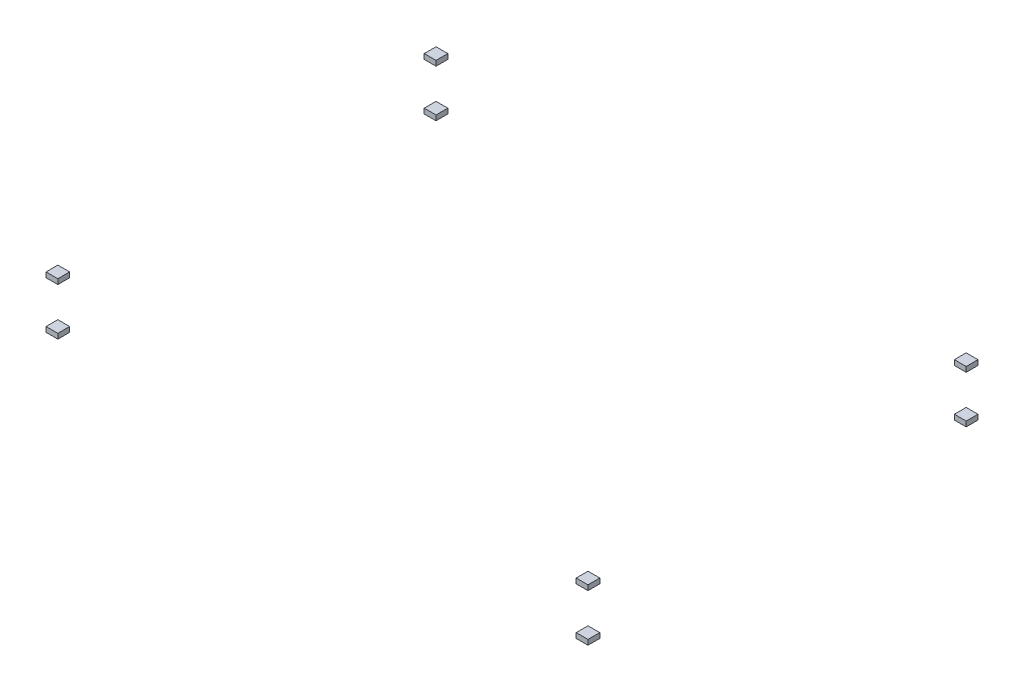
ISO-10303-21;
HEADER;
FILE_DESCRIPTION(('STEP AP214'),'2;1');
FILE_NAME('part.step','',(''),(''),'','','');
FILE_SCHEMA(('AUTOMOTIVE_DESIGN { 1 0 10303 214 1 1 1 1 }'));
ENDSEC;
DATA;
#1=APPLICATION_CONTEXT('core data for automotive mechanical design processes');
#2=APPLICATION_PROTOCOL_DEFINITION('international standard','automotive_design',2000,#1);
#3=PRODUCT_CONTEXT('',#1,'mechanical');
#4=PRODUCT('Part','Part','',(#3));
#5=PRODUCT_RELATED_PRODUCT_CATEGORY('part','',(#4));
#6=PRODUCT_DEFINITION_FORMATION('','',#4);
#7=PRODUCT_DEFINITION_CONTEXT('part definition',#1,'design');
#8=PRODUCT_DEFINITION('design','',#6,#7);
#9=PRODUCT_DEFINITION_SHAPE('','',#8);
#10=(LENGTH_UNIT() NAMED_UNIT(*) SI_UNIT(.MILLI.,.METRE.));
#11=(NAMED_UNIT(*) PLANE_ANGLE_UNIT() SI_UNIT($,.RADIAN.));
#12=(NAMED_UNIT(*) SI_UNIT($,.STERADIAN.) SOLID_ANGLE_UNIT());
#13=UNCERTAINTY_MEASURE_WITH_UNIT(LENGTH_MEASURE(1.E-05),#10,'distance_accuracy_value','');
#14=(GEOMETRIC_REPRESENTATION_CONTEXT(3) GLOBAL_UNCERTAINTY_ASSIGNED_CONTEXT((#13)) GLOBAL_UNIT_ASSIGNED_CONTEXT((#10,
#11,#12)) REPRESENTATION_CONTEXT('',''));
#15=CARTESIAN_POINT('',(0.,0.,0.));
#16=DIRECTION('',(0.,0.,1.));
#17=DIRECTION('',(1.,0.,0.));
#18=AXIS2_PLACEMENT_3D('',#15,#16,#17);
#19=CARTESIAN_POINT('',(3070.,250.,2310.));
#20=DIRECTION('',(1.,0.,0.));
#21=DIRECTION('',(0.,0.,-1.));
#22=AXIS2_PLACEMENT_3D('',#19,#20,#21);
#23=PLANE('',#22);
#24=DIRECTION('',(0.,-1.,0.));
#25=VECTOR('',#24,1.);
#26=CARTESIAN_POINT('',(3070.,250.,2170.));
#27=LINE('',#26,#25);
#28=CARTESIAN_POINT('',(3070.,310.,2170.));
#29=VERTEX_POINT('',#28);
#30=CARTESIAN_POINT('',(3070.,250.,2170.));
#31=VERTEX_POINT('',#30);
#32=EDGE_CURVE('E114',#29,#31,#27,.T.);
#33=ORIENTED_EDGE('',*,*,#32,.T.);
#34=DIRECTION('',(0.,0.,-1.));
#35=VECTOR('',#34,1.);
#36=CARTESIAN_POINT('',(3070.,250.,2310.));
#37=LINE('',#36,#35);
#38=CARTESIAN_POINT('',(3070.,250.,2310.));
#39=VERTEX_POINT('',#38);
#40=EDGE_CURVE('E12',#39,#31,#37,.T.);
#41=ORIENTED_EDGE('',*,*,#40,.F.);
#42=DIRECTION('',(0.,-1.,0.));
#43=VECTOR('',#42,1.);
#44=CARTESIAN_POINT('',(3070.,250.,2310.));
#45=LINE('',#44,#43);
#46=CARTESIAN_POINT('',(3070.,310.,2310.));
#47=VERTEX_POINT('',#46);
#48=EDGE_CURVE('E101',#47,#39,#45,.T.);
#49=ORIENTED_EDGE('',*,*,#48,.F.);
#50=DIRECTION('',(0.,0.,-1.));
#51=VECTOR('',#50,1.);
#52=CARTESIAN_POINT('',(3070.,310.,2310.));
#53=LINE('',#52,#51);
#54=EDGE_CURVE('E108',#47,#29,#53,.T.);
#55=ORIENTED_EDGE('',*,*,#54,.T.);
#56=EDGE_LOOP('',(#33,#41,#49,#55));
#57=FACE_BOUND('',#56,.T.);
#58=ADVANCED_FACE('F49',(#57),#23,.F.);
#59=CARTESIAN_POINT('',(3070.,250.,2310.));
#60=DIRECTION('',(0.,1.,0.));
#61=DIRECTION('',(0.,0.,1.));
#62=AXIS2_PLACEMENT_3D('',#59,#60,#61);
#63=PLANE('',#62);
#64=DIRECTION('',(1.,0.,0.));
#65=VECTOR('',#64,1.);
#66=CARTESIAN_POINT('',(3070.,250.,2170.));
#67=LINE('',#66,#65);
#68=CARTESIAN_POINT('',(3210.,250.,2170.));
#69=VERTEX_POINT('',#68);
#70=EDGE_CURVE('E104',#31,#69,#67,.T.);
#71=ORIENTED_EDGE('',*,*,#70,.T.);
#72=DIRECTION('',(0.,0.,-1.));
#73=VECTOR('',#72,1.);
#74=CARTESIAN_POINT('',(3210.,250.,2310.));
#75=LINE('',#74,#73);
#76=CARTESIAN_POINT('',(3210.,250.,2310.));
#77=VERTEX_POINT('',#76);
#78=EDGE_CURVE('E59',#77,#69,#75,.T.);
#79=ORIENTED_EDGE('',*,*,#78,.F.);
#80=DIRECTION('',(1.,0.,0.));
#81=VECTOR('',#80,1.);
#82=CARTESIAN_POINT('',(3070.,250.,2310.));
#83=LINE('',#82,#81);
#84=EDGE_CURVE('E96',#39,#77,#83,.T.);
#85=ORIENTED_EDGE('',*,*,#84,.F.);
#86=ORIENTED_EDGE('',*,*,#40,.T.);
#87=EDGE_LOOP('',(#71,#79,#85,#86));
#88=FACE_BOUND('',#87,.T.);
#89=ADVANCED_FACE('F102',(#88),#63,.F.);
#90=CARTESIAN_POINT('',(3210.,250.,2310.));
#91=DIRECTION('',(-1.,0.,0.));
#92=DIRECTION('',(0.,0.,1.));
#93=AXIS2_PLACEMENT_3D('',#90,#91,#92);
#94=PLANE('',#93);
#95=DIRECTION('',(0.,1.,0.));
#96=VECTOR('',#95,1.);
#97=CARTESIAN_POINT('',(3210.,250.,2170.));
#98=LINE('',#97,#96);
#99=CARTESIAN_POINT('',(3210.,310.,2170.));
#100=VERTEX_POINT('',#99);
#101=EDGE_CURVE('E84',#69,#100,#98,.T.);
#102=ORIENTED_EDGE('',*,*,#101,.T.);
#103=DIRECTION('',(0.,0.,-1.));
#104=VECTOR('',#103,1.);
#105=CARTESIAN_POINT('',(3210.,310.,2310.));
#106=LINE('',#105,#104);
#107=CARTESIAN_POINT('',(3210.,310.,2310.));
#108=VERTEX_POINT('',#107);
#109=EDGE_CURVE('E106',#108,#100,#106,.T.);
#110=ORIENTED_EDGE('',*,*,#109,.F.);
#111=DIRECTION('',(0.,1.,0.));
#112=VECTOR('',#111,1.);
#113=CARTESIAN_POINT('',(3210.,250.,2310.));
#114=LINE('',#113,#112);
#115=EDGE_CURVE('E97',#77,#108,#114,.T.);
#116=ORIENTED_EDGE('',*,*,#115,.F.);
#117=ORIENTED_EDGE('',*,*,#78,.T.);
#118=EDGE_LOOP('',(#102,#110,#116,#117));
#119=FACE_BOUND('',#118,.T.);
#120=ADVANCED_FACE('F110',(#119),#94,.F.);
#121=CARTESIAN_POINT('',(3070.,310.,2310.));
#122=DIRECTION('',(0.,-1.,0.));
#123=DIRECTION('',(0.,0.,-1.));
#124=AXIS2_PLACEMENT_3D('',#121,#122,#123);
#125=PLANE('',#124);
#126=DIRECTION('',(-1.,0.,0.));
#127=VECTOR('',#126,1.);
#128=CARTESIAN_POINT('',(3070.,310.,2170.));
#129=LINE('',#128,#127);
#130=EDGE_CURVE('E90',#100,#29,#129,.T.);
#131=ORIENTED_EDGE('',*,*,#130,.T.);
#132=ORIENTED_EDGE('',*,*,#54,.F.);
#133=DIRECTION('',(-1.,0.,0.));
#134=VECTOR('',#133,1.);
#135=CARTESIAN_POINT('',(3070.,310.,2310.));
#136=LINE('',#135,#134);
#137=EDGE_CURVE('E67',#108,#47,#136,.T.);
#138=ORIENTED_EDGE('',*,*,#137,.F.);
#139=ORIENTED_EDGE('',*,*,#109,.T.);
#140=EDGE_LOOP('',(#131,#132,#138,#139));
#141=FACE_BOUND('',#140,.T.);
#142=ADVANCED_FACE('F118',(#141),#125,.F.);
#143=CARTESIAN_POINT('',(0.,0.,2310.));
#144=DIRECTION('',(0.,0.,-1.));
#145=DIRECTION('',(-1.,0.,0.));
#146=AXIS2_PLACEMENT_3D('',#143,#144,#145);
#147=PLANE('',#146);
#148=ORIENTED_EDGE('',*,*,#48,.T.);
#149=ORIENTED_EDGE('',*,*,#84,.T.);
#150=ORIENTED_EDGE('',*,*,#115,.T.);
#151=ORIENTED_EDGE('',*,*,#137,.T.);
#152=EDGE_LOOP('',(#148,#149,#150,#151));
#153=FACE_BOUND('',#152,.T.);
#154=ADVANCED_FACE('F100',(#153),#147,.F.);
#155=CARTESIAN_POINT('',(0.,0.,2170.));
#156=DIRECTION('',(0.,0.,-1.));
#157=DIRECTION('',(-1.,0.,0.));
#158=AXIS2_PLACEMENT_3D('',#155,#156,#157);
#159=PLANE('',#158);
#160=ORIENTED_EDGE('',*,*,#32,.F.);
#161=ORIENTED_EDGE('',*,*,#130,.F.);
#162=ORIENTED_EDGE('',*,*,#101,.F.);
#163=ORIENTED_EDGE('',*,*,#70,.F.);
#164=EDGE_LOOP('',(#160,#161,#162,#163));
#165=FACE_BOUND('',#164,.T.);
#166=ADVANCED_FACE('F124',(#165),#159,.T.);
#167=CLOSED_SHELL('',(#58,#89,#120,#142,#154,#166));
#168=MANIFOLD_SOLID_BREP('B2',#167);
#169=CARTESIAN_POINT('',(3070.,250.,-2170.));
#170=DIRECTION('',(1.,0.,0.));
#171=DIRECTION('',(0.,0.,-1.));
#172=AXIS2_PLACEMENT_3D('',#169,#170,#171);
#173=PLANE('',#172);
#174=DIRECTION('',(0.,-1.,0.));
#175=VECTOR('',#174,1.);
#176=CARTESIAN_POINT('',(3070.,250.,-2310.));
#177=LINE('',#176,#175);
#178=CARTESIAN_POINT('',(3070.,310.,-2310.));
#179=VERTEX_POINT('',#178);
#180=CARTESIAN_POINT('',(3070.,250.,-2310.));
#181=VERTEX_POINT('',#180);
#182=EDGE_CURVE('E250',#179,#181,#177,.T.);
#183=ORIENTED_EDGE('',*,*,#182,.T.);
#184=DIRECTION('',(0.,0.,-1.));
#185=VECTOR('',#184,1.);
#186=CARTESIAN_POINT('',(3070.,250.,-2170.));
#187=LINE('',#186,#185);
#188=CARTESIAN_POINT('',(3070.,250.,-2170.));
#189=VERTEX_POINT('',#188);
#190=EDGE_CURVE('E48',#189,#181,#187,.T.);
#191=ORIENTED_EDGE('',*,*,#190,.F.);
#192=DIRECTION('',(0.,-1.,0.));
#193=VECTOR('',#192,1.);
#194=CARTESIAN_POINT('',(3070.,250.,-2170.));
#195=LINE('',#194,#193);
#196=CARTESIAN_POINT('',(3070.,310.,-2170.));
#197=VERTEX_POINT('',#196);
#198=EDGE_CURVE('E233',#197,#189,#195,.T.);
#199=ORIENTED_EDGE('',*,*,#198,.F.);
#200=DIRECTION('',(0.,0.,-1.));
#201=VECTOR('',#200,1.);
#202=CARTESIAN_POINT('',(3070.,310.,-2170.));
#203=LINE('',#202,#201);
#204=EDGE_CURVE('E245',#197,#179,#203,.T.);
#205=ORIENTED_EDGE('',*,*,#204,.T.);
#206=EDGE_LOOP('',(#183,#191,#199,#205));
#207=FACE_BOUND('',#206,.T.);
#208=ADVANCED_FACE('F184',(#207),#173,.F.);
#209=CARTESIAN_POINT('',(3070.,250.,-2170.));
#210=DIRECTION('',(0.,1.,0.));
#211=DIRECTION('',(0.,0.,1.));
#212=AXIS2_PLACEMENT_3D('',#209,#210,#211);
#213=PLANE('',#212);
#214=DIRECTION('',(1.,0.,0.));
#215=VECTOR('',#214,1.);
#216=CARTESIAN_POINT('',(3070.,250.,-2310.));
#217=LINE('',#216,#215);
#218=CARTESIAN_POINT('',(3210.,250.,-2310.));
#219=VERTEX_POINT('',#218);
#220=EDGE_CURVE('E239',#181,#219,#217,.T.);
#221=ORIENTED_EDGE('',*,*,#220,.T.);
#222=DIRECTION('',(0.,0.,-1.));
#223=VECTOR('',#222,1.);
#224=CARTESIAN_POINT('',(3210.,250.,-2170.));
#225=LINE('',#224,#223);
#226=CARTESIAN_POINT('',(3210.,250.,-2170.));
#227=VERTEX_POINT('',#226);
#228=EDGE_CURVE('E195',#227,#219,#225,.T.);
#229=ORIENTED_EDGE('',*,*,#228,.F.);
#230=DIRECTION('',(1.,0.,0.));
#231=VECTOR('',#230,1.);
#232=CARTESIAN_POINT('',(3070.,250.,-2170.));
#233=LINE('',#232,#231);
#234=EDGE_CURVE('E228',#189,#227,#233,.T.);
#235=ORIENTED_EDGE('',*,*,#234,.F.);
#236=ORIENTED_EDGE('',*,*,#190,.T.);
#237=EDGE_LOOP('',(#221,#229,#235,#236));
#238=FACE_BOUND('',#237,.T.);
#239=ADVANCED_FACE('F236',(#238),#213,.F.);
#240=CARTESIAN_POINT('',(3210.,250.,-2170.));
#241=DIRECTION('',(-1.,0.,0.));
#242=DIRECTION('',(0.,0.,1.));
#243=AXIS2_PLACEMENT_3D('',#240,#241,#242);
#244=PLANE('',#243);
#245=DIRECTION('',(0.,1.,0.));
#246=VECTOR('',#245,1.);
#247=CARTESIAN_POINT('',(3210.,250.,-2310.));
#248=LINE('',#247,#246);
#249=CARTESIAN_POINT('',(3210.,310.,-2310.));
#250=VERTEX_POINT('',#249);
#251=EDGE_CURVE('E220',#219,#250,#248,.T.);
#252=ORIENTED_EDGE('',*,*,#251,.T.);
#253=DIRECTION('',(0.,0.,-1.));
#254=VECTOR('',#253,1.);
#255=CARTESIAN_POINT('',(3210.,310.,-2170.));
#256=LINE('',#255,#254);
#257=CARTESIAN_POINT('',(3210.,310.,-2170.));
#258=VERTEX_POINT('',#257);
#259=EDGE_CURVE('E238',#258,#250,#256,.T.);
#260=ORIENTED_EDGE('',*,*,#259,.F.);
#261=DIRECTION('',(0.,1.,0.));
#262=VECTOR('',#261,1.);
#263=CARTESIAN_POINT('',(3210.,250.,-2170.));
#264=LINE('',#263,#262);
#265=EDGE_CURVE('E234',#227,#258,#264,.T.);
#266=ORIENTED_EDGE('',*,*,#265,.F.);
#267=ORIENTED_EDGE('',*,*,#228,.T.);
#268=EDGE_LOOP('',(#252,#260,#266,#267));
#269=FACE_BOUND('',#268,.T.);
#270=ADVANCED_FACE('F242',(#269),#244,.F.);
#271=CARTESIAN_POINT('',(3070.,310.,-2170.));
#272=DIRECTION('',(0.,-1.,0.));
#273=DIRECTION('',(0.,0.,-1.));
#274=AXIS2_PLACEMENT_3D('',#271,#272,#273);
#275=PLANE('',#274);
#276=DIRECTION('',(-1.,0.,0.));
#277=VECTOR('',#276,1.);
#278=CARTESIAN_POINT('',(3070.,310.,-2310.));
#279=LINE('',#278,#277);
#280=EDGE_CURVE('E224',#250,#179,#279,.T.);
#281=ORIENTED_EDGE('',*,*,#280,.T.);
#282=ORIENTED_EDGE('',*,*,#204,.F.);
#283=DIRECTION('',(-1.,0.,0.));
#284=VECTOR('',#283,1.);
#285=CARTESIAN_POINT('',(3070.,310.,-2170.));
#286=LINE('',#285,#284);
#287=EDGE_CURVE('E199',#258,#197,#286,.T.);
#288=ORIENTED_EDGE('',*,*,#287,.F.);
#289=ORIENTED_EDGE('',*,*,#259,.T.);
#290=EDGE_LOOP('',(#281,#282,#288,#289));
#291=FACE_BOUND('',#290,.T.);
#292=ADVANCED_FACE('F255',(#291),#275,.F.);
#293=CARTESIAN_POINT('',(0.,0.,-2170.));
#294=DIRECTION('',(0.,0.,-1.));
#295=DIRECTION('',(-1.,0.,0.));
#296=AXIS2_PLACEMENT_3D('',#293,#294,#295);
#297=PLANE('',#296);
#298=ORIENTED_EDGE('',*,*,#198,.T.);
#299=ORIENTED_EDGE('',*,*,#234,.T.);
#300=ORIENTED_EDGE('',*,*,#265,.T.);
#301=ORIENTED_EDGE('',*,*,#287,.T.);
#302=EDGE_LOOP('',(#298,#299,#300,#301));
#303=FACE_BOUND('',#302,.T.);
#304=ADVANCED_FACE('F232',(#303),#297,.F.);
#305=CARTESIAN_POINT('',(0.,0.,-2310.));
#306=DIRECTION('',(0.,0.,-1.));
#307=DIRECTION('',(-1.,0.,0.));
#308=AXIS2_PLACEMENT_3D('',#305,#306,#307);
#309=PLANE('',#308);
#310=ORIENTED_EDGE('',*,*,#182,.F.);
#311=ORIENTED_EDGE('',*,*,#280,.F.);
#312=ORIENTED_EDGE('',*,*,#251,.F.);
#313=ORIENTED_EDGE('',*,*,#220,.F.);
#314=EDGE_LOOP('',(#310,#311,#312,#313));
#315=FACE_BOUND('',#314,.T.);
#316=ADVANCED_FACE('F260',(#315),#309,.T.);
#317=CLOSED_SHELL('',(#208,#239,#270,#292,#304,#316));
#318=MANIFOLD_SOLID_BREP('B6',#317);
#319=CARTESIAN_POINT('',(3070.,-310.,2310.));
#320=DIRECTION('',(1.,0.,0.));
#321=DIRECTION('',(0.,0.,-1.));
#322=AXIS2_PLACEMENT_3D('',#319,#320,#321);
#323=PLANE('',#322);
#324=DIRECTION('',(0.,-1.,0.));
#325=VECTOR('',#324,1.);
#326=CARTESIAN_POINT('',(3070.,-310.,2170.));
#327=LINE('',#326,#325);
#328=CARTESIAN_POINT('',(3070.,-250.,2170.));
#329=VERTEX_POINT('',#328);
#330=CARTESIAN_POINT('',(3070.,-310.,2170.));
#331=VERTEX_POINT('',#330);
#332=EDGE_CURVE('E381',#329,#331,#327,.T.);
#333=ORIENTED_EDGE('',*,*,#332,.T.);
#334=DIRECTION('',(0.,0.,-1.));
#335=VECTOR('',#334,1.);
#336=CARTESIAN_POINT('',(3070.,-310.,2310.));
#337=LINE('',#336,#335);
#338=CARTESIAN_POINT('',(3070.,-310.,2310.));
#339=VERTEX_POINT('',#338);
#340=EDGE_CURVE('E185',#339,#331,#337,.T.);
#341=ORIENTED_EDGE('',*,*,#340,.F.);
#342=DIRECTION('',(0.,-1.,0.));
#343=VECTOR('',#342,1.);
#344=CARTESIAN_POINT('',(3070.,-310.,2310.));
#345=LINE('',#344,#343);
#346=CARTESIAN_POINT('',(3070.,-250.,2310.));
#347=VERTEX_POINT('',#346);
#348=EDGE_CURVE('E369',#347,#339,#345,.T.);
#349=ORIENTED_EDGE('',*,*,#348,.F.);
#350=DIRECTION('',(0.,0.,-1.));
#351=VECTOR('',#350,1.);
#352=CARTESIAN_POINT('',(3070.,-250.,2310.));
#353=LINE('',#352,#351);
#354=EDGE_CURVE('E380',#347,#329,#353,.T.);
#355=ORIENTED_EDGE('',*,*,#354,.T.);
#356=EDGE_LOOP('',(#333,#341,#349,#355));
#357=FACE_BOUND('',#356,.T.);
#358=ADVANCED_FACE('F318',(#357),#323,.F.);
#359=CARTESIAN_POINT('',(3070.,-310.,2310.));
#360=DIRECTION('',(0.,1.,0.));
#361=DIRECTION('',(0.,0.,1.));
#362=AXIS2_PLACEMENT_3D('',#359,#360,#361);
#363=PLANE('',#362);
#364=DIRECTION('',(1.,0.,0.));
#365=VECTOR('',#364,1.);
#366=CARTESIAN_POINT('',(3070.,-310.,2170.));
#367=LINE('',#366,#365);
#368=CARTESIAN_POINT('',(3210.,-310.,2170.));
#369=VERTEX_POINT('',#368);
#370=EDGE_CURVE('E373',#331,#369,#367,.T.);
#371=ORIENTED_EDGE('',*,*,#370,.T.);
#372=DIRECTION('',(0.,0.,-1.));
#373=VECTOR('',#372,1.);
#374=CARTESIAN_POINT('',(3210.,-310.,2310.));
#375=LINE('',#374,#373);
#376=CARTESIAN_POINT('',(3210.,-310.,2310.));
#377=VERTEX_POINT('',#376);
#378=EDGE_CURVE('E326',#377,#369,#375,.T.);
#379=ORIENTED_EDGE('',*,*,#378,.F.);
#380=DIRECTION('',(1.,0.,0.));
#381=VECTOR('',#380,1.);
#382=CARTESIAN_POINT('',(3070.,-310.,2310.));
#383=LINE('',#382,#381);
#384=EDGE_CURVE('E365',#339,#377,#383,.T.);
#385=ORIENTED_EDGE('',*,*,#384,.F.);
#386=ORIENTED_EDGE('',*,*,#340,.T.);
#387=EDGE_LOOP('',(#371,#379,#385,#386));
#388=FACE_BOUND('',#387,.T.);
#389=ADVANCED_FACE('F375',(#388),#363,.F.);
#390=CARTESIAN_POINT('',(3210.,-310.,2310.));
#391=DIRECTION('',(-1.,0.,0.));
#392=DIRECTION('',(0.,0.,1.));
#393=AXIS2_PLACEMENT_3D('',#390,#391,#392);
#394=PLANE('',#393);
#395=DIRECTION('',(0.,1.,0.));
#396=VECTOR('',#395,1.);
#397=CARTESIAN_POINT('',(3210.,-310.,2170.));
#398=LINE('',#397,#396);
#399=CARTESIAN_POINT('',(3210.,-250.,2170.));
#400=VERTEX_POINT('',#399);
#401=EDGE_CURVE('E352',#369,#400,#398,.T.);
#402=ORIENTED_EDGE('',*,*,#401,.T.);
#403=DIRECTION('',(0.,0.,-1.));
#404=VECTOR('',#403,1.);
#405=CARTESIAN_POINT('',(3210.,-250.,2310.));
#406=LINE('',#405,#404);
#407=CARTESIAN_POINT('',(3210.,-250.,2310.));
#408=VERTEX_POINT('',#407);
#409=EDGE_CURVE('E372',#408,#400,#406,.T.);
#410=ORIENTED_EDGE('',*,*,#409,.F.);
#411=DIRECTION('',(0.,1.,0.));
#412=VECTOR('',#411,1.);
#413=CARTESIAN_POINT('',(3210.,-310.,2310.));
#414=LINE('',#413,#412);
#415=EDGE_CURVE('E370',#377,#408,#414,.T.);
#416=ORIENTED_EDGE('',*,*,#415,.F.);
#417=ORIENTED_EDGE('',*,*,#378,.T.);
#418=EDGE_LOOP('',(#402,#410,#416,#417));
#419=FACE_BOUND('',#418,.T.);
#420=ADVANCED_FACE('F374',(#419),#394,.F.);
#421=CARTESIAN_POINT('',(3070.,-250.,2310.));
#422=DIRECTION('',(0.,-1.,0.));
#423=DIRECTION('',(0.,0.,-1.));
#424=AXIS2_PLACEMENT_3D('',#421,#422,#423);
#425=PLANE('',#424);
#426=DIRECTION('',(-1.,0.,0.));
#427=VECTOR('',#426,1.);
#428=CARTESIAN_POINT('',(3070.,-250.,2170.));
#429=LINE('',#428,#427);
#430=EDGE_CURVE('E360',#400,#329,#429,.T.);
#431=ORIENTED_EDGE('',*,*,#430,.T.);
#432=ORIENTED_EDGE('',*,*,#354,.F.);
#433=DIRECTION('',(-1.,0.,0.));
#434=VECTOR('',#433,1.);
#435=CARTESIAN_POINT('',(3070.,-250.,2310.));
#436=LINE('',#435,#434);
#437=EDGE_CURVE('E331',#408,#347,#436,.T.);
#438=ORIENTED_EDGE('',*,*,#437,.F.);
#439=ORIENTED_EDGE('',*,*,#409,.T.);
#440=EDGE_LOOP('',(#431,#432,#438,#439));
#441=FACE_BOUND('',#440,.T.);
#442=ADVANCED_FACE('F389',(#441),#425,.F.);
#443=CARTESIAN_POINT('',(0.,0.,2310.));
#444=DIRECTION('',(0.,0.,-1.));
#445=DIRECTION('',(-1.,0.,0.));
#446=AXIS2_PLACEMENT_3D('',#443,#444,#445);
#447=PLANE('',#446);
#448=ORIENTED_EDGE('',*,*,#348,.T.);
#449=ORIENTED_EDGE('',*,*,#384,.T.);
#450=ORIENTED_EDGE('',*,*,#415,.T.);
#451=ORIENTED_EDGE('',*,*,#437,.T.);
#452=EDGE_LOOP('',(#448,#449,#450,#451));
#453=FACE_BOUND('',#452,.T.);
#454=ADVANCED_FACE('F364',(#453),#447,.F.);
#455=CARTESIAN_POINT('',(0.,0.,2170.));
#456=DIRECTION('',(0.,0.,-1.));
#457=DIRECTION('',(-1.,0.,0.));
#458=AXIS2_PLACEMENT_3D('',#455,#456,#457);
#459=PLANE('',#458);
#460=ORIENTED_EDGE('',*,*,#332,.F.);
#461=ORIENTED_EDGE('',*,*,#430,.F.);
#462=ORIENTED_EDGE('',*,*,#401,.F.);
#463=ORIENTED_EDGE('',*,*,#370,.F.);
#464=EDGE_LOOP('',(#460,#461,#462,#463));
#465=FACE_BOUND('',#464,.T.);
#466=ADVANCED_FACE('F392',(#465),#459,.T.);
#467=CLOSED_SHELL('',(#358,#389,#420,#442,#454,#466));
#468=MANIFOLD_SOLID_BREP('B45',#467);
#469=CARTESIAN_POINT('',(3070.,-310.,-2170.));
#470=DIRECTION('',(1.,0.,0.));
#471=DIRECTION('',(0.,0.,-1.));
#472=AXIS2_PLACEMENT_3D('',#469,#470,#471);
#473=PLANE('',#472);
#474=DIRECTION('',(0.,-1.,0.));
#475=VECTOR('',#474,1.);
#476=CARTESIAN_POINT('',(3070.,-310.,-2310.));
#477=LINE('',#476,#475);
#478=CARTESIAN_POINT('',(3070.,-250.,-2310.));
#479=VERTEX_POINT('',#478);
#480=CARTESIAN_POINT('',(3070.,-310.,-2310.));
#481=VERTEX_POINT('',#480);
#482=EDGE_CURVE('E513',#479,#481,#477,.T.);
#483=ORIENTED_EDGE('',*,*,#482,.T.);
#484=DIRECTION('',(0.,0.,-1.));
#485=VECTOR('',#484,1.);
#486=CARTESIAN_POINT('',(3070.,-310.,-2170.));
#487=LINE('',#486,#485);
#488=CARTESIAN_POINT('',(3070.,-310.,-2170.));
#489=VERTEX_POINT('',#488);
#490=EDGE_CURVE('E316',#489,#481,#487,.T.);
#491=ORIENTED_EDGE('',*,*,#490,.F.);
#492=DIRECTION('',(0.,-1.,0.));
#493=VECTOR('',#492,1.);
#494=CARTESIAN_POINT('',(3070.,-310.,-2170.));
#495=LINE('',#494,#493);
#496=CARTESIAN_POINT('',(3070.,-250.,-2170.));
#497=VERTEX_POINT('',#496);
#498=EDGE_CURVE('E505',#497,#489,#495,.T.);
#499=ORIENTED_EDGE('',*,*,#498,.F.);
#500=DIRECTION('',(0.,0.,-1.));
#501=VECTOR('',#500,1.);
#502=CARTESIAN_POINT('',(3070.,-250.,-2170.));
#503=LINE('',#502,#501);
#504=EDGE_CURVE('E512',#497,#479,#503,.T.);
#505=ORIENTED_EDGE('',*,*,#504,.T.);
#506=EDGE_LOOP('',(#483,#491,#499,#505));
#507=FACE_BOUND('',#506,.T.);
#508=ADVANCED_FACE('F455',(#507),#473,.F.);
#509=CARTESIAN_POINT('',(3070.,-310.,-2170.));
#510=DIRECTION('',(0.,1.,0.));
#511=DIRECTION('',(0.,0.,1.));
#512=AXIS2_PLACEMENT_3D('',#509,#510,#511);
#513=PLANE('',#512);
#514=DIRECTION('',(1.,0.,0.));
#515=VECTOR('',#514,1.);
#516=CARTESIAN_POINT('',(3070.,-310.,-2310.));
#517=LINE('',#516,#515);
#518=CARTESIAN_POINT('',(3210.,-310.,-2310.));
#519=VERTEX_POINT('',#518);
#520=EDGE_CURVE('E510',#481,#519,#517,.T.);
#521=ORIENTED_EDGE('',*,*,#520,.T.);
#522=DIRECTION('',(0.,0.,-1.));
#523=VECTOR('',#522,1.);
#524=CARTESIAN_POINT('',(3210.,-310.,-2170.));
#525=LINE('',#524,#523);
#526=CARTESIAN_POINT('',(3210.,-310.,-2170.));
#527=VERTEX_POINT('',#526);
#528=EDGE_CURVE('E458',#527,#519,#525,.T.);
#529=ORIENTED_EDGE('',*,*,#528,.F.);
#530=DIRECTION('',(1.,0.,0.));
#531=VECTOR('',#530,1.);
#532=CARTESIAN_POINT('',(3070.,-310.,-2170.));
#533=LINE('',#532,#531);
#534=EDGE_CURVE('E499',#489,#527,#533,.T.);
#535=ORIENTED_EDGE('',*,*,#534,.F.);
#536=ORIENTED_EDGE('',*,*,#490,.T.);
#537=EDGE_LOOP('',(#521,#529,#535,#536));
#538=FACE_BOUND('',#537,.T.);
#539=ADVANCED_FACE('F507',(#538),#513,.F.);
#540=CARTESIAN_POINT('',(3210.,-310.,-2170.));
#541=DIRECTION('',(-1.,0.,0.));
#542=DIRECTION('',(0.,0.,1.));
#543=AXIS2_PLACEMENT_3D('',#540,#541,#542);
#544=PLANE('',#543);
#545=DIRECTION('',(0.,1.,0.));
#546=VECTOR('',#545,1.);
#547=CARTESIAN_POINT('',(3210.,-310.,-2310.));
#548=LINE('',#547,#546);
#549=CARTESIAN_POINT('',(3210.,-250.,-2310.));
#550=VERTEX_POINT('',#549);
#551=EDGE_CURVE('E484',#519,#550,#548,.T.);
#552=ORIENTED_EDGE('',*,*,#551,.T.);
#553=DIRECTION('',(0.,0.,-1.));
#554=VECTOR('',#553,1.);
#555=CARTESIAN_POINT('',(3210.,-250.,-2170.));
#556=LINE('',#555,#554);
#557=CARTESIAN_POINT('',(3210.,-250.,-2170.));
#558=VERTEX_POINT('',#557);
#559=EDGE_CURVE('E509',#558,#550,#556,.T.);
#560=ORIENTED_EDGE('',*,*,#559,.F.);
#561=DIRECTION('',(0.,1.,0.));
#562=VECTOR('',#561,1.);
#563=CARTESIAN_POINT('',(3210.,-310.,-2170.));
#564=LINE('',#563,#562);
#565=EDGE_CURVE('E502',#527,#558,#564,.T.);
#566=ORIENTED_EDGE('',*,*,#565,.F.);
#567=ORIENTED_EDGE('',*,*,#528,.T.);
#568=EDGE_LOOP('',(#552,#560,#566,#567));
#569=FACE_BOUND('',#568,.T.);
#570=ADVANCED_FACE('F506',(#569),#544,.F.);
#571=CARTESIAN_POINT('',(3070.,-250.,-2170.));
#572=DIRECTION('',(0.,-1.,0.));
#573=DIRECTION('',(0.,0.,-1.));
#574=AXIS2_PLACEMENT_3D('',#571,#572,#573);
#575=PLANE('',#574);
#576=DIRECTION('',(-1.,0.,0.));
#577=VECTOR('',#576,1.);
#578=CARTESIAN_POINT('',(3070.,-250.,-2310.));
#579=LINE('',#578,#577);
#580=EDGE_CURVE('E491',#550,#479,#579,.T.);
#581=ORIENTED_EDGE('',*,*,#580,.T.);
#582=ORIENTED_EDGE('',*,*,#504,.F.);
#583=DIRECTION('',(-1.,0.,0.));
#584=VECTOR('',#583,1.);
#585=CARTESIAN_POINT('',(3070.,-250.,-2170.));
#586=LINE('',#585,#584);
#587=EDGE_CURVE('E469',#558,#497,#586,.T.);
#588=ORIENTED_EDGE('',*,*,#587,.F.);
#589=ORIENTED_EDGE('',*,*,#559,.T.);
#590=EDGE_LOOP('',(#581,#582,#588,#589));
#591=FACE_BOUND('',#590,.T.);
#592=ADVANCED_FACE('F525',(#591),#575,.F.);
#593=CARTESIAN_POINT('',(0.,0.,-2170.));
#594=DIRECTION('',(0.,0.,-1.));
#595=DIRECTION('',(-1.,0.,0.));
#596=AXIS2_PLACEMENT_3D('',#593,#594,#595);
#597=PLANE('',#596);
#598=ORIENTED_EDGE('',*,*,#498,.T.);
#599=ORIENTED_EDGE('',*,*,#534,.T.);
#600=ORIENTED_EDGE('',*,*,#565,.T.);
#601=ORIENTED_EDGE('',*,*,#587,.T.);
#602=EDGE_LOOP('',(#598,#599,#600,#601));
#603=FACE_BOUND('',#602,.T.);
#604=ADVANCED_FACE('F496',(#603),#597,.F.);
#605=CARTESIAN_POINT('',(0.,0.,-2310.));
#606=DIRECTION('',(0.,0.,-1.));
#607=DIRECTION('',(-1.,0.,0.));
#608=AXIS2_PLACEMENT_3D('',#605,#606,#607);
#609=PLANE('',#608);
#610=ORIENTED_EDGE('',*,*,#482,.F.);
#611=ORIENTED_EDGE('',*,*,#580,.F.);
#612=ORIENTED_EDGE('',*,*,#551,.F.);
#613=ORIENTED_EDGE('',*,*,#520,.F.);
#614=EDGE_LOOP('',(#610,#611,#612,#613));
#615=FACE_BOUND('',#614,.T.);
#616=ADVANCED_FACE('F523',(#615),#609,.T.);
#617=CLOSED_SHELL('',(#508,#539,#570,#592,#604,#616));
#618=MANIFOLD_SOLID_BREP('B177',#617);
#619=CARTESIAN_POINT('',(-3210.,250.,2310.));
#620=DIRECTION('',(1.,0.,0.));
#621=DIRECTION('',(0.,0.,-1.));
#622=AXIS2_PLACEMENT_3D('',#619,#620,#621);
#623=PLANE('',#622);
#624=DIRECTION('',(0.,-1.,0.));
#625=VECTOR('',#624,1.);
#626=CARTESIAN_POINT('',(-3210.,250.,2170.));
#627=LINE('',#626,#625);
#628=CARTESIAN_POINT('',(-3210.,310.,2170.));
#629=VERTEX_POINT('',#628);
#630=CARTESIAN_POINT('',(-3210.,250.,2170.));
#631=VERTEX_POINT('',#630);
#632=EDGE_CURVE('E647',#629,#631,#627,.T.);
#633=ORIENTED_EDGE('',*,*,#632,.T.);
#634=DIRECTION('',(0.,0.,-1.));
#635=VECTOR('',#634,1.);
#636=CARTESIAN_POINT('',(-3210.,250.,2310.));
#637=LINE('',#636,#635);
#638=CARTESIAN_POINT('',(-3210.,250.,2310.));
#639=VERTEX_POINT('',#638);
#640=EDGE_CURVE('E448',#639,#631,#637,.T.);
#641=ORIENTED_EDGE('',*,*,#640,.F.);
#642=DIRECTION('',(0.,-1.,0.));
#643=VECTOR('',#642,1.);
#644=CARTESIAN_POINT('',(-3210.,250.,2310.));
#645=LINE('',#644,#643);
#646=CARTESIAN_POINT('',(-3210.,310.,2310.));
#647=VERTEX_POINT('',#646);
#648=EDGE_CURVE('E637',#647,#639,#645,.T.);
#649=ORIENTED_EDGE('',*,*,#648,.F.);
#650=DIRECTION('',(0.,0.,-1.));
#651=VECTOR('',#650,1.);
#652=CARTESIAN_POINT('',(-3210.,310.,2310.));
#653=LINE('',#652,#651);
#654=EDGE_CURVE('E642',#647,#629,#653,.T.);
#655=ORIENTED_EDGE('',*,*,#654,.T.);
#656=EDGE_LOOP('',(#633,#641,#649,#655));
#657=FACE_BOUND('',#656,.T.);
#658=ADVANCED_FACE('F588',(#657),#623,.F.);
#659=CARTESIAN_POINT('',(-3210.,250.,2310.));
#660=DIRECTION('',(0.,1.,0.));
#661=DIRECTION('',(0.,0.,1.));
#662=AXIS2_PLACEMENT_3D('',#659,#660,#661);
#663=PLANE('',#662);
#664=DIRECTION('',(1.,0.,0.));
#665=VECTOR('',#664,1.);
#666=CARTESIAN_POINT('',(-3210.,250.,2170.));
#667=LINE('',#666,#665);
#668=CARTESIAN_POINT('',(-3070.,250.,2170.));
#669=VERTEX_POINT('',#668);
#670=EDGE_CURVE('E643',#631,#669,#667,.T.);
#671=ORIENTED_EDGE('',*,*,#670,.T.);
#672=DIRECTION('',(0.,0.,-1.));
#673=VECTOR('',#672,1.);
#674=CARTESIAN_POINT('',(-3070.,250.,2310.));
#675=LINE('',#674,#673);
#676=CARTESIAN_POINT('',(-3070.,250.,2310.));
#677=VERTEX_POINT('',#676);
#678=EDGE_CURVE('E592',#677,#669,#675,.T.);
#679=ORIENTED_EDGE('',*,*,#678,.F.);
#680=DIRECTION('',(1.,0.,0.));
#681=VECTOR('',#680,1.);
#682=CARTESIAN_POINT('',(-3210.,250.,2310.));
#683=LINE('',#682,#681);
#684=EDGE_CURVE('E635',#639,#677,#683,.T.);
#685=ORIENTED_EDGE('',*,*,#684,.F.);
#686=ORIENTED_EDGE('',*,*,#640,.T.);
#687=EDGE_LOOP('',(#671,#679,#685,#686));
#688=FACE_BOUND('',#687,.T.);
#689=ADVANCED_FACE('F639',(#688),#663,.F.);
#690=CARTESIAN_POINT('',(-3070.,250.,2310.));
#691=DIRECTION('',(-1.,0.,0.));
#692=DIRECTION('',(0.,0.,1.));
#693=AXIS2_PLACEMENT_3D('',#690,#691,#692);
#694=PLANE('',#693);
#695=DIRECTION('',(0.,1.,0.));
#696=VECTOR('',#695,1.);
#697=CARTESIAN_POINT('',(-3070.,250.,2170.));
#698=LINE('',#697,#696);
#699=CARTESIAN_POINT('',(-3070.,310.,2170.));
#700=VERTEX_POINT('',#699);
#701=EDGE_CURVE('E616',#669,#700,#698,.T.);
#702=ORIENTED_EDGE('',*,*,#701,.T.);
#703=DIRECTION('',(0.,0.,-1.));
#704=VECTOR('',#703,1.);
#705=CARTESIAN_POINT('',(-3070.,310.,2310.));
#706=LINE('',#705,#704);
#707=CARTESIAN_POINT('',(-3070.,310.,2310.));
#708=VERTEX_POINT('',#707);
#709=EDGE_CURVE('E645',#708,#700,#706,.T.);
#710=ORIENTED_EDGE('',*,*,#709,.F.);
#711=DIRECTION('',(0.,1.,0.));
#712=VECTOR('',#711,1.);
#713=CARTESIAN_POINT('',(-3070.,250.,2310.));
#714=LINE('',#713,#712);
#715=EDGE_CURVE('E633',#677,#708,#714,.T.);
#716=ORIENTED_EDGE('',*,*,#715,.F.);
#717=ORIENTED_EDGE('',*,*,#678,.T.);
#718=EDGE_LOOP('',(#702,#710,#716,#717));
#719=FACE_BOUND('',#718,.T.);
#720=ADVANCED_FACE('F641',(#719),#694,.F.);
#721=CARTESIAN_POINT('',(-3210.,310.,2310.));
#722=DIRECTION('',(0.,-1.,0.));
#723=DIRECTION('',(0.,0.,-1.));
#724=AXIS2_PLACEMENT_3D('',#721,#722,#723);
#725=PLANE('',#724);
#726=DIRECTION('',(-1.,0.,0.));
#727=VECTOR('',#726,1.);
#728=CARTESIAN_POINT('',(-3210.,310.,2170.));
#729=LINE('',#728,#727);
#730=EDGE_CURVE('E623',#700,#629,#729,.T.);
#731=ORIENTED_EDGE('',*,*,#730,.T.);
#732=ORIENTED_EDGE('',*,*,#654,.F.);
#733=DIRECTION('',(-1.,0.,0.));
#734=VECTOR('',#733,1.);
#735=CARTESIAN_POINT('',(-3210.,310.,2310.));
#736=LINE('',#735,#734);
#737=EDGE_CURVE('E605',#708,#647,#736,.T.);
#738=ORIENTED_EDGE('',*,*,#737,.F.);
#739=ORIENTED_EDGE('',*,*,#709,.T.);
#740=EDGE_LOOP('',(#731,#732,#738,#739));
#741=FACE_BOUND('',#740,.T.);
#742=ADVANCED_FACE('F656',(#741),#725,.F.);
#743=CARTESIAN_POINT('',(0.,0.,2310.));
#744=DIRECTION('',(0.,0.,-1.));
#745=DIRECTION('',(-1.,0.,0.));
#746=AXIS2_PLACEMENT_3D('',#743,#744,#745);
#747=PLANE('',#746);
#748=ORIENTED_EDGE('',*,*,#648,.T.);
#749=ORIENTED_EDGE('',*,*,#684,.T.);
#750=ORIENTED_EDGE('',*,*,#715,.T.);
#751=ORIENTED_EDGE('',*,*,#737,.T.);
#752=EDGE_LOOP('',(#748,#749,#750,#751));
#753=FACE_BOUND('',#752,.T.);
#754=ADVANCED_FACE('F634',(#753),#747,.F.);
#755=CARTESIAN_POINT('',(0.,0.,2170.));
#756=DIRECTION('',(0.,0.,-1.));
#757=DIRECTION('',(-1.,0.,0.));
#758=AXIS2_PLACEMENT_3D('',#755,#756,#757);
#759=PLANE('',#758);
#760=ORIENTED_EDGE('',*,*,#632,.F.);
#761=ORIENTED_EDGE('',*,*,#730,.F.);
#762=ORIENTED_EDGE('',*,*,#701,.F.);
#763=ORIENTED_EDGE('',*,*,#670,.F.);
#764=EDGE_LOOP('',(#760,#761,#762,#763));
#765=FACE_BOUND('',#764,.T.);
#766=ADVANCED_FACE('F658',(#765),#759,.T.);
#767=CLOSED_SHELL('',(#658,#689,#720,#742,#754,#766));
#768=MANIFOLD_SOLID_BREP('B309',#767);
#769=CARTESIAN_POINT('',(-3210.,250.,-2170.));
#770=DIRECTION('',(1.,0.,0.));
#771=DIRECTION('',(0.,0.,-1.));
#772=AXIS2_PLACEMENT_3D('',#769,#770,#771);
#773=PLANE('',#772);
#774=DIRECTION('',(0.,-1.,0.));
#775=VECTOR('',#774,1.);
#776=CARTESIAN_POINT('',(-3210.,250.,-2310.));
#777=LINE('',#776,#775);
#778=CARTESIAN_POINT('',(-3210.,310.,-2310.));
#779=VERTEX_POINT('',#778);
#780=CARTESIAN_POINT('',(-3210.,250.,-2310.));
#781=VERTEX_POINT('',#780);
#782=EDGE_CURVE('E784',#779,#781,#777,.T.);
#783=ORIENTED_EDGE('',*,*,#782,.T.);
#784=DIRECTION('',(0.,0.,-1.));
#785=VECTOR('',#784,1.);
#786=CARTESIAN_POINT('',(-3210.,250.,-2170.));
#787=LINE('',#786,#785);
#788=CARTESIAN_POINT('',(-3210.,250.,-2170.));
#789=VERTEX_POINT('',#788);
#790=EDGE_CURVE('E585',#789,#781,#787,.T.);
#791=ORIENTED_EDGE('',*,*,#790,.F.);
#792=DIRECTION('',(0.,-1.,0.));
#793=VECTOR('',#792,1.);
#794=CARTESIAN_POINT('',(-3210.,250.,-2170.));
#795=LINE('',#794,#793);
#796=CARTESIAN_POINT('',(-3210.,310.,-2170.));
#797=VERTEX_POINT('',#796);
#798=EDGE_CURVE('E772',#797,#789,#795,.T.);
#799=ORIENTED_EDGE('',*,*,#798,.F.);
#800=DIRECTION('',(0.,0.,-1.));
#801=VECTOR('',#800,1.);
#802=CARTESIAN_POINT('',(-3210.,310.,-2170.));
#803=LINE('',#802,#801);
#804=EDGE_CURVE('E776',#797,#779,#803,.T.);
#805=ORIENTED_EDGE('',*,*,#804,.T.);
#806=EDGE_LOOP('',(#783,#791,#799,#805));
#807=FACE_BOUND('',#806,.T.);
#808=ADVANCED_FACE('F718',(#807),#773,.F.);
#809=CARTESIAN_POINT('',(-3210.,250.,-2170.));
#810=DIRECTION('',(0.,1.,0.));
#811=DIRECTION('',(0.,0.,1.));
#812=AXIS2_PLACEMENT_3D('',#809,#810,#811);
#813=PLANE('',#812);
#814=DIRECTION('',(1.,0.,0.));
#815=VECTOR('',#814,1.);
#816=CARTESIAN_POINT('',(-3210.,250.,-2310.));
#817=LINE('',#816,#815);
#818=CARTESIAN_POINT('',(-3070.,250.,-2310.));
#819=VERTEX_POINT('',#818);
#820=EDGE_CURVE('E773',#781,#819,#817,.T.);
#821=ORIENTED_EDGE('',*,*,#820,.T.);
#822=DIRECTION('',(0.,0.,-1.));
#823=VECTOR('',#822,1.);
#824=CARTESIAN_POINT('',(-3070.,250.,-2170.));
#825=LINE('',#824,#823);
#826=CARTESIAN_POINT('',(-3070.,250.,-2170.));
#827=VERTEX_POINT('',#826);
#828=EDGE_CURVE('E729',#827,#819,#825,.T.);
#829=ORIENTED_EDGE('',*,*,#828,.F.);
#830=DIRECTION('',(1.,0.,0.));
#831=VECTOR('',#830,1.);
#832=CARTESIAN_POINT('',(-3210.,250.,-2170.));
#833=LINE('',#832,#831);
#834=EDGE_CURVE('E766',#789,#827,#833,.T.);
#835=ORIENTED_EDGE('',*,*,#834,.F.);
#836=ORIENTED_EDGE('',*,*,#790,.T.);
#837=EDGE_LOOP('',(#821,#829,#835,#836));
#838=FACE_BOUND('',#837,.T.);
#839=ADVANCED_FACE('F771',(#838),#813,.F.);
#840=CARTESIAN_POINT('',(-3070.,250.,-2170.));
#841=DIRECTION('',(-1.,0.,0.));
#842=DIRECTION('',(0.,0.,1.));
#843=AXIS2_PLACEMENT_3D('',#840,#841,#842);
#844=PLANE('',#843);
#845=DIRECTION('',(0.,1.,0.));
#846=VECTOR('',#845,1.);
#847=CARTESIAN_POINT('',(-3070.,250.,-2310.));
#848=LINE('',#847,#846);
#849=CARTESIAN_POINT('',(-3070.,310.,-2310.));
#850=VERTEX_POINT('',#849);
#851=EDGE_CURVE('E751',#819,#850,#848,.T.);
#852=ORIENTED_EDGE('',*,*,#851,.T.);
#853=DIRECTION('',(0.,0.,-1.));
#854=VECTOR('',#853,1.);
#855=CARTESIAN_POINT('',(-3070.,310.,-2170.));
#856=LINE('',#855,#854);
#857=CARTESIAN_POINT('',(-3070.,310.,-2170.));
#858=VERTEX_POINT('',#857);
#859=EDGE_CURVE('E777',#858,#850,#856,.T.);
#860=ORIENTED_EDGE('',*,*,#859,.F.);
#861=DIRECTION('',(0.,1.,0.));
#862=VECTOR('',#861,1.);
#863=CARTESIAN_POINT('',(-3070.,250.,-2170.));
#864=LINE('',#863,#862);
#865=EDGE_CURVE('E768',#827,#858,#864,.T.);
#866=ORIENTED_EDGE('',*,*,#865,.F.);
#867=ORIENTED_EDGE('',*,*,#828,.T.);
#868=EDGE_LOOP('',(#852,#860,#866,#867));
#869=FACE_BOUND('',#868,.T.);
#870=ADVANCED_FACE('F779',(#869),#844,.F.);
#871=CARTESIAN_POINT('',(-3210.,310.,-2170.));
#872=DIRECTION('',(0.,-1.,0.));
#873=DIRECTION('',(0.,0.,-1.));
#874=AXIS2_PLACEMENT_3D('',#871,#872,#873);
#875=PLANE('',#874);
#876=DIRECTION('',(-1.,0.,0.));
#877=VECTOR('',#876,1.);
#878=CARTESIAN_POINT('',(-3210.,310.,-2310.));
#879=LINE('',#878,#877);
#880=EDGE_CURVE('E757',#850,#779,#879,.T.);
#881=ORIENTED_EDGE('',*,*,#880,.T.);
#882=ORIENTED_EDGE('',*,*,#804,.F.);
#883=DIRECTION('',(-1.,0.,0.));
#884=VECTOR('',#883,1.);
#885=CARTESIAN_POINT('',(-3210.,310.,-2170.));
#886=LINE('',#885,#884);
#887=EDGE_CURVE('E737',#858,#797,#886,.T.);
#888=ORIENTED_EDGE('',*,*,#887,.F.);
#889=ORIENTED_EDGE('',*,*,#859,.T.);
#890=EDGE_LOOP('',(#881,#882,#888,#889));
#891=FACE_BOUND('',#890,.T.);
#892=ADVANCED_FACE('F788',(#891),#875,.F.);
#893=CARTESIAN_POINT('',(0.,0.,-2170.));
#894=DIRECTION('',(0.,0.,-1.));
#895=DIRECTION('',(-1.,0.,0.));
#896=AXIS2_PLACEMENT_3D('',#893,#894,#895);
#897=PLANE('',#896);
#898=ORIENTED_EDGE('',*,*,#798,.T.);
#899=ORIENTED_EDGE('',*,*,#834,.T.);
#900=ORIENTED_EDGE('',*,*,#865,.T.);
#901=ORIENTED_EDGE('',*,*,#887,.T.);
#902=EDGE_LOOP('',(#898,#899,#900,#901));
#903=FACE_BOUND('',#902,.T.);
#904=ADVANCED_FACE('F770',(#903),#897,.F.);
#905=CARTESIAN_POINT('',(0.,0.,-2310.));
#906=DIRECTION('',(0.,0.,-1.));
#907=DIRECTION('',(-1.,0.,0.));
#908=AXIS2_PLACEMENT_3D('',#905,#906,#907);
#909=PLANE('',#908);
#910=ORIENTED_EDGE('',*,*,#782,.F.);
#911=ORIENTED_EDGE('',*,*,#880,.F.);
#912=ORIENTED_EDGE('',*,*,#851,.F.);
#913=ORIENTED_EDGE('',*,*,#820,.F.);
#914=EDGE_LOOP('',(#910,#911,#912,#913));
#915=FACE_BOUND('',#914,.T.);
#916=ADVANCED_FACE('F795',(#915),#909,.T.);
#917=CLOSED_SHELL('',(#808,#839,#870,#892,#904,#916));
#918=MANIFOLD_SOLID_BREP('B441',#917);
#919=CARTESIAN_POINT('',(-3210.,-310.,2310.));
#920=DIRECTION('',(1.,0.,0.));
#921=DIRECTION('',(0.,0.,-1.));
#922=AXIS2_PLACEMENT_3D('',#919,#920,#921);
#923=PLANE('',#922);
#924=DIRECTION('',(0.,-1.,0.));
#925=VECTOR('',#924,1.);
#926=CARTESIAN_POINT('',(-3210.,-310.,2170.));
#927=LINE('',#926,#925);
#928=CARTESIAN_POINT('',(-3210.,-250.,2170.));
#929=VERTEX_POINT('',#928);
#930=CARTESIAN_POINT('',(-3210.,-310.,2170.));
#931=VERTEX_POINT('',#930);
#932=EDGE_CURVE('E918',#929,#931,#927,.T.);
#933=ORIENTED_EDGE('',*,*,#932,.T.);
#934=DIRECTION('',(0.,0.,-1.));
#935=VECTOR('',#934,1.);
#936=CARTESIAN_POINT('',(-3210.,-310.,2310.));
#937=LINE('',#936,#935);
#938=CARTESIAN_POINT('',(-3210.,-310.,2310.));
#939=VERTEX_POINT('',#938);
#940=EDGE_CURVE('E719',#939,#931,#937,.T.);
#941=ORIENTED_EDGE('',*,*,#940,.F.);
#942=DIRECTION('',(0.,-1.,0.));
#943=VECTOR('',#942,1.);
#944=CARTESIAN_POINT('',(-3210.,-310.,2310.));
#945=LINE('',#944,#943);
#946=CARTESIAN_POINT('',(-3210.,-250.,2310.));
#947=VERTEX_POINT('',#946);
#948=EDGE_CURVE('E901',#947,#939,#945,.T.);
#949=ORIENTED_EDGE('',*,*,#948,.F.);
#950=DIRECTION('',(0.,0.,-1.));
#951=VECTOR('',#950,1.);
#952=CARTESIAN_POINT('',(-3210.,-250.,2310.));
#953=LINE('',#952,#951);
#954=EDGE_CURVE('E912',#947,#929,#953,.T.);
#955=ORIENTED_EDGE('',*,*,#954,.T.);
#956=EDGE_LOOP('',(#933,#941,#949,#955));
#957=FACE_BOUND('',#956,.T.);
#958=ADVANCED_FACE('F854',(#957),#923,.F.);
#959=CARTESIAN_POINT('',(-3210.,-310.,2310.));
#960=DIRECTION('',(0.,1.,0.));
#961=DIRECTION('',(0.,0.,1.));
#962=AXIS2_PLACEMENT_3D('',#959,#960,#961);
#963=PLANE('',#962);
#964=DIRECTION('',(1.,0.,0.));
#965=VECTOR('',#964,1.);
#966=CARTESIAN_POINT('',(-3210.,-310.,2170.));
#967=LINE('',#966,#965);
#968=CARTESIAN_POINT('',(-3070.,-310.,2170.));
#969=VERTEX_POINT('',#968);
#970=EDGE_CURVE('E909',#931,#969,#967,.T.);
#971=ORIENTED_EDGE('',*,*,#970,.T.);
#972=DIRECTION('',(0.,0.,-1.));
#973=VECTOR('',#972,1.);
#974=CARTESIAN_POINT('',(-3070.,-310.,2310.));
#975=LINE('',#974,#973);
#976=CARTESIAN_POINT('',(-3070.,-310.,2310.));
#977=VERTEX_POINT('',#976);
#978=EDGE_CURVE('E863',#977,#969,#975,.T.);
#979=ORIENTED_EDGE('',*,*,#978,.F.);
#980=DIRECTION('',(1.,0.,0.));
#981=VECTOR('',#980,1.);
#982=CARTESIAN_POINT('',(-3210.,-310.,2310.));
#983=LINE('',#982,#981);
#984=EDGE_CURVE('E899',#939,#977,#983,.T.);
#985=ORIENTED_EDGE('',*,*,#984,.F.);
#986=ORIENTED_EDGE('',*,*,#940,.T.);
#987=EDGE_LOOP('',(#971,#979,#985,#986));
#988=FACE_BOUND('',#987,.T.);
#989=ADVANCED_FACE('F910',(#988),#963,.F.);
#990=CARTESIAN_POINT('',(-3070.,-310.,2310.));
#991=DIRECTION('',(-1.,0.,0.));
#992=DIRECTION('',(0.,0.,1.));
#993=AXIS2_PLACEMENT_3D('',#990,#991,#992);
#994=PLANE('',#993);
#995=DIRECTION('',(0.,1.,0.));
#996=VECTOR('',#995,1.);
#997=CARTESIAN_POINT('',(-3070.,-310.,2170.));
#998=LINE('',#997,#996);
#999=CARTESIAN_POINT('',(-3070.,-250.,2170.));
#1000=VERTEX_POINT('',#999);
#1001=EDGE_CURVE('E887',#969,#1000,#998,.T.);
#1002=ORIENTED_EDGE('',*,*,#1001,.T.);
#1003=DIRECTION('',(0.,0.,-1.));
#1004=VECTOR('',#1003,1.);
#1005=CARTESIAN_POINT('',(-3070.,-250.,2310.));
#1006=LINE('',#1005,#1004);
#1007=CARTESIAN_POINT('',(-3070.,-250.,2310.));
#1008=VERTEX_POINT('',#1007);
#1009=EDGE_CURVE('E906',#1008,#1000,#1006,.T.);
#1010=ORIENTED_EDGE('',*,*,#1009,.F.);
#1011=DIRECTION('',(0.,1.,0.));
#1012=VECTOR('',#1011,1.);
#1013=CARTESIAN_POINT('',(-3070.,-310.,2310.));
#1014=LINE('',#1013,#1012);
#1015=EDGE_CURVE('E904',#977,#1008,#1014,.T.);
#1016=ORIENTED_EDGE('',*,*,#1015,.F.);
#1017=ORIENTED_EDGE('',*,*,#978,.T.);
#1018=EDGE_LOOP('',(#1002,#1010,#1016,#1017));
#1019=FACE_BOUND('',#1018,.T.);
#1020=ADVANCED_FACE('F908',(#1019),#994,.F.);
#1021=CARTESIAN_POINT('',(-3210.,-250.,2310.));
#1022=DIRECTION('',(0.,-1.,0.));
#1023=DIRECTION('',(0.,0.,-1.));
#1024=AXIS2_PLACEMENT_3D('',#1021,#1022,#1023);
#1025=PLANE('',#1024);
#1026=DIRECTION('',(-1.,0.,0.));
#1027=VECTOR('',#1026,1.);
#1028=CARTESIAN_POINT('',(-3210.,-250.,2170.));
#1029=LINE('',#1028,#1027);
#1030=EDGE_CURVE('E895',#1000,#929,#1029,.T.);
#1031=ORIENTED_EDGE('',*,*,#1030,.T.);
#1032=ORIENTED_EDGE('',*,*,#954,.F.);
#1033=DIRECTION('',(-1.,0.,0.));
#1034=VECTOR('',#1033,1.);
#1035=CARTESIAN_POINT('',(-3210.,-250.,2310.));
#1036=LINE('',#1035,#1034);
#1037=EDGE_CURVE('E867',#1008,#947,#1036,.T.);
#1038=ORIENTED_EDGE('',*,*,#1037,.F.);
#1039=ORIENTED_EDGE('',*,*,#1009,.T.);
#1040=EDGE_LOOP('',(#1031,#1032,#1038,#1039));
#1041=FACE_BOUND('',#1040,.T.);
#1042=ADVANCED_FACE('F923',(#1041),#1025,.F.);
#1043=CARTESIAN_POINT('',(0.,0.,2310.));
#1044=DIRECTION('',(0.,0.,-1.));
#1045=DIRECTION('',(-1.,0.,0.));
#1046=AXIS2_PLACEMENT_3D('',#1043,#1044,#1045);
#1047=PLANE('',#1046);
#1048=ORIENTED_EDGE('',*,*,#948,.T.);
#1049=ORIENTED_EDGE('',*,*,#984,.T.);
#1050=ORIENTED_EDGE('',*,*,#1015,.T.);
#1051=ORIENTED_EDGE('',*,*,#1037,.T.);
#1052=EDGE_LOOP('',(#1048,#1049,#1050,#1051));
#1053=FACE_BOUND('',#1052,.T.);
#1054=ADVANCED_FACE('F898',(#1053),#1047,.F.);
#1055=CARTESIAN_POINT('',(0.,0.,2170.));
#1056=DIRECTION('',(0.,0.,-1.));
#1057=DIRECTION('',(-1.,0.,0.));
#1058=AXIS2_PLACEMENT_3D('',#1055,#1056,#1057);
#1059=PLANE('',#1058);
#1060=ORIENTED_EDGE('',*,*,#932,.F.);
#1061=ORIENTED_EDGE('',*,*,#1030,.F.);
#1062=ORIENTED_EDGE('',*,*,#1001,.F.);
#1063=ORIENTED_EDGE('',*,*,#970,.F.);
#1064=EDGE_LOOP('',(#1060,#1061,#1062,#1063));
#1065=FACE_BOUND('',#1064,.T.);
#1066=ADVANCED_FACE('F926',(#1065),#1059,.T.);
#1067=CLOSED_SHELL('',(#958,#989,#1020,#1042,#1054,#1066));
#1068=MANIFOLD_SOLID_BREP('B579',#1067);
#1069=CARTESIAN_POINT('',(-3210.,-310.,-2170.));
#1070=DIRECTION('',(1.,0.,0.));
#1071=DIRECTION('',(0.,0.,-1.));
#1072=AXIS2_PLACEMENT_3D('',#1069,#1070,#1071);
#1073=PLANE('',#1072);
#1074=DIRECTION('',(0.,-1.,0.));
#1075=VECTOR('',#1074,1.);
#1076=CARTESIAN_POINT('',(-3210.,-310.,-2310.));
#1077=LINE('',#1076,#1075);
#1078=CARTESIAN_POINT('',(-3210.,-250.,-2310.));
#1079=VERTEX_POINT('',#1078);
#1080=CARTESIAN_POINT('',(-3210.,-310.,-2310.));
#1081=VERTEX_POINT('',#1080);
#1082=EDGE_CURVE('E1039',#1079,#1081,#1077,.T.);
#1083=ORIENTED_EDGE('',*,*,#1082,.T.);
#1084=DIRECTION('',(0.,0.,-1.));
#1085=VECTOR('',#1084,1.);
#1086=CARTESIAN_POINT('',(-3210.,-310.,-2170.));
#1087=LINE('',#1086,#1085);
#1088=CARTESIAN_POINT('',(-3210.,-310.,-2170.));
#1089=VERTEX_POINT('',#1088);
#1090=EDGE_CURVE('E852',#1089,#1081,#1087,.T.);
#1091=ORIENTED_EDGE('',*,*,#1090,.F.);
#1092=DIRECTION('',(0.,-1.,0.));
#1093=VECTOR('',#1092,1.);
#1094=CARTESIAN_POINT('',(-3210.,-310.,-2170.));
#1095=LINE('',#1094,#1093);
#1096=CARTESIAN_POINT('',(-3210.,-250.,-2170.));
#1097=VERTEX_POINT('',#1096);
#1098=EDGE_CURVE('E1026',#1097,#1089,#1095,.T.);
#1099=ORIENTED_EDGE('',*,*,#1098,.F.);
#1100=DIRECTION('',(0.,0.,-1.));
#1101=VECTOR('',#1100,1.);
#1102=CARTESIAN_POINT('',(-3210.,-250.,-2170.));
#1103=LINE('',#1102,#1101);
#1104=EDGE_CURVE('E1036',#1097,#1079,#1103,.T.);
#1105=ORIENTED_EDGE('',*,*,#1104,.T.);
#1106=EDGE_LOOP('',(#1083,#1091,#1099,#1105));
#1107=FACE_BOUND('',#1106,.T.);
#1108=ADVANCED_FACE('F980',(#1107),#1073,.F.);
#1109=CARTESIAN_POINT('',(-3210.,-310.,-2170.));
#1110=DIRECTION('',(0.,1.,0.));
#1111=DIRECTION('',(0.,0.,1.));
#1112=AXIS2_PLACEMENT_3D('',#1109,#1110,#1111);
#1113=PLANE('',#1112);
#1114=DIRECTION('',(1.,0.,0.));
#1115=VECTOR('',#1114,1.);
#1116=CARTESIAN_POINT('',(-3210.,-310.,-2310.));
#1117=LINE('',#1116,#1115);
#1118=CARTESIAN_POINT('',(-3070.,-310.,-2310.));
#1119=VERTEX_POINT('',#1118);
#1120=EDGE_CURVE('E1035',#1081,#1119,#1117,.T.);
#1121=ORIENTED_EDGE('',*,*,#1120,.T.);
#1122=DIRECTION('',(0.,0.,-1.));
#1123=VECTOR('',#1122,1.);
#1124=CARTESIAN_POINT('',(-3070.,-310.,-2170.));
#1125=LINE('',#1124,#1123);
#1126=CARTESIAN_POINT('',(-3070.,-310.,-2170.));
#1127=VERTEX_POINT('',#1126);
#1128=EDGE_CURVE('E984',#1127,#1119,#1125,.T.);
#1129=ORIENTED_EDGE('',*,*,#1128,.F.);
#1130=DIRECTION('',(1.,0.,0.));
#1131=VECTOR('',#1130,1.);
#1132=CARTESIAN_POINT('',(-3210.,-310.,-2170.));
#1133=LINE('',#1132,#1131);
#1134=EDGE_CURVE('E1021',#1089,#1127,#1133,.T.);
#1135=ORIENTED_EDGE('',*,*,#1134,.F.);
#1136=ORIENTED_EDGE('',*,*,#1090,.T.);
#1137=EDGE_LOOP('',(#1121,#1129,#1135,#1136));
#1138=FACE_BOUND('',#1137,.T.);
#1139=ADVANCED_FACE('F1031',(#1138),#1113,.F.);
#1140=CARTESIAN_POINT('',(-3070.,-310.,-2170.));
#1141=DIRECTION('',(-1.,0.,0.));
#1142=DIRECTION('',(0.,0.,1.));
#1143=AXIS2_PLACEMENT_3D('',#1140,#1141,#1142);
#1144=PLANE('',#1143);
#1145=DIRECTION('',(0.,1.,0.));
#1146=VECTOR('',#1145,1.);
#1147=CARTESIAN_POINT('',(-3070.,-310.,-2310.));
#1148=LINE('',#1147,#1146);
#1149=CARTESIAN_POINT('',(-3070.,-250.,-2310.));
#1150=VERTEX_POINT('',#1149);
#1151=EDGE_CURVE('E1008',#1119,#1150,#1148,.T.);
#1152=ORIENTED_EDGE('',*,*,#1151,.T.);
#1153=DIRECTION('',(0.,0.,-1.));
#1154=VECTOR('',#1153,1.);
#1155=CARTESIAN_POINT('',(-3070.,-250.,-2170.));
#1156=LINE('',#1155,#1154);
#1157=CARTESIAN_POINT('',(-3070.,-250.,-2170.));
#1158=VERTEX_POINT('',#1157);
#1159=EDGE_CURVE('E1033',#1158,#1150,#1156,.T.);
#1160=ORIENTED_EDGE('',*,*,#1159,.F.);
#1161=DIRECTION('',(0.,1.,0.));
#1162=VECTOR('',#1161,1.);
#1163=CARTESIAN_POINT('',(-3070.,-310.,-2170.));
#1164=LINE('',#1163,#1162);
#1165=EDGE_CURVE('E1028',#1127,#1158,#1164,.T.);
#1166=ORIENTED_EDGE('',*,*,#1165,.F.);
#1167=ORIENTED_EDGE('',*,*,#1128,.T.);
#1168=EDGE_LOOP('',(#1152,#1160,#1166,#1167));
#1169=FACE_BOUND('',#1168,.T.);
#1170=ADVANCED_FACE('F1032',(#1169),#1144,.F.);
#1171=CARTESIAN_POINT('',(-3210.,-250.,-2170.));
#1172=DIRECTION('',(0.,-1.,0.));
#1173=DIRECTION('',(0.,0.,-1.));
#1174=AXIS2_PLACEMENT_3D('',#1171,#1172,#1173);
#1175=PLANE('',#1174);
#1176=DIRECTION('',(-1.,0.,0.));
#1177=VECTOR('',#1176,1.);
#1178=CARTESIAN_POINT('',(-3210.,-250.,-2310.));
#1179=LINE('',#1178,#1177);
#1180=EDGE_CURVE('E1017',#1150,#1079,#1179,.T.);
#1181=ORIENTED_EDGE('',*,*,#1180,.T.);
#1182=ORIENTED_EDGE('',*,*,#1104,.F.);
#1183=DIRECTION('',(-1.,0.,0.));
#1184=VECTOR('',#1183,1.);
#1185=CARTESIAN_POINT('',(-3210.,-250.,-2170.));
#1186=LINE('',#1185,#1184);
#1187=EDGE_CURVE('E994',#1158,#1097,#1186,.T.);
#1188=ORIENTED_EDGE('',*,*,#1187,.F.);
#1189=ORIENTED_EDGE('',*,*,#1159,.T.);
#1190=EDGE_LOOP('',(#1181,#1182,#1188,#1189));
#1191=FACE_BOUND('',#1190,.T.);
#1192=ADVANCED_FACE('F1050',(#1191),#1175,.F.);
#1193=CARTESIAN_POINT('',(0.,0.,-2170.));
#1194=DIRECTION('',(0.,0.,-1.));
#1195=DIRECTION('',(-1.,0.,0.));
#1196=AXIS2_PLACEMENT_3D('',#1193,#1194,#1195);
#1197=PLANE('',#1196);
#1198=ORIENTED_EDGE('',*,*,#1098,.T.);
#1199=ORIENTED_EDGE('',*,*,#1134,.T.);
#1200=ORIENTED_EDGE('',*,*,#1165,.T.);
#1201=ORIENTED_EDGE('',*,*,#1187,.T.);
#1202=EDGE_LOOP('',(#1198,#1199,#1200,#1201));
#1203=FACE_BOUND('',#1202,.T.);
#1204=ADVANCED_FACE('F1025',(#1203),#1197,.F.);
#1205=CARTESIAN_POINT('',(0.,0.,-2310.));
#1206=DIRECTION('',(0.,0.,-1.));
#1207=DIRECTION('',(-1.,0.,0.));
#1208=AXIS2_PLACEMENT_3D('',#1205,#1206,#1207);
#1209=PLANE('',#1208);
#1210=ORIENTED_EDGE('',*,*,#1082,.F.);
#1211=ORIENTED_EDGE('',*,*,#1180,.F.);
#1212=ORIENTED_EDGE('',*,*,#1151,.F.);
#1213=ORIENTED_EDGE('',*,*,#1120,.F.);
#1214=EDGE_LOOP('',(#1210,#1211,#1212,#1213));
#1215=FACE_BOUND('',#1214,.T.);
#1216=ADVANCED_FACE('F1048',(#1215),#1209,.T.);
#1217=CLOSED_SHELL('',(#1108,#1139,#1170,#1192,#1204,#1216));
#1218=MANIFOLD_SOLID_BREP('B715',#1217);
#1219=ADVANCED_BREP_SHAPE_REPRESENTATION('',(#18,#168,#318,#468,#618,#768,#918,#1068,#1218),#14);
#1220=SHAPE_DEFINITION_REPRESENTATION(#9,#1219);
ENDSEC;
END-ISO-10303-21;
